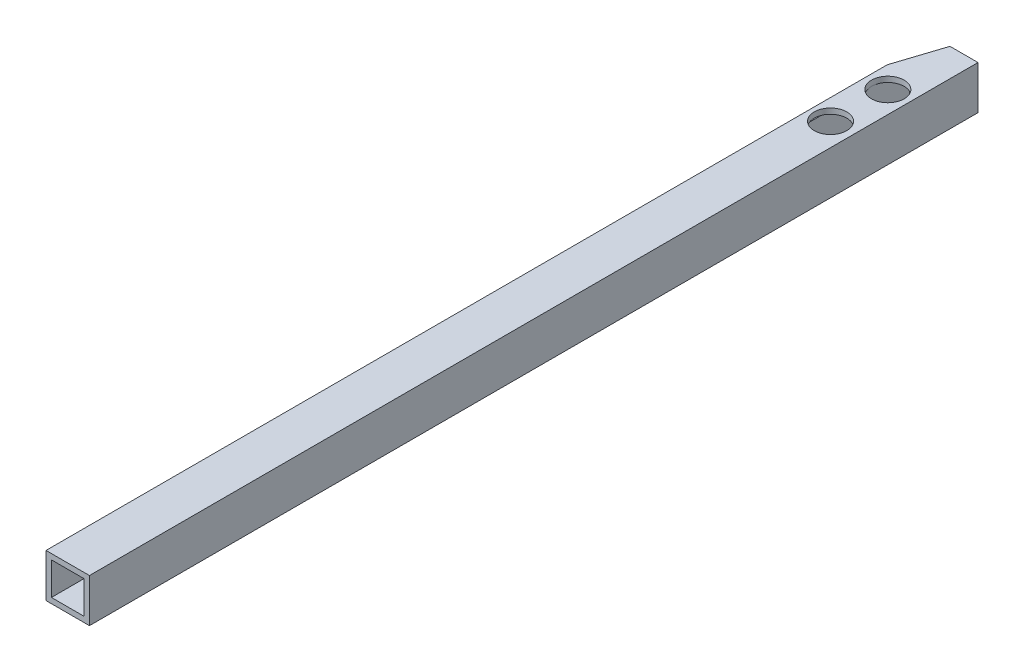
ISO-10303-21;
HEADER;
FILE_DESCRIPTION(('STEP AP214'),'2;1');
FILE_NAME('part.step','',(''),(''),'','','');
FILE_SCHEMA(('AUTOMOTIVE_DESIGN { 1 0 10303 214 1 1 1 1 }'));
ENDSEC;
DATA;
#1=APPLICATION_CONTEXT('core data for automotive mechanical design processes');
#2=APPLICATION_PROTOCOL_DEFINITION('international standard','automotive_design',2000,#1);
#3=PRODUCT_CONTEXT('',#1,'mechanical');
#4=PRODUCT('Part','Part','',(#3));
#5=PRODUCT_RELATED_PRODUCT_CATEGORY('part','',(#4));
#6=PRODUCT_DEFINITION_FORMATION('','',#4);
#7=PRODUCT_DEFINITION_CONTEXT('part definition',#1,'design');
#8=PRODUCT_DEFINITION('design','',#6,#7);
#9=PRODUCT_DEFINITION_SHAPE('','',#8);
#10=(LENGTH_UNIT() NAMED_UNIT(*) SI_UNIT(.MILLI.,.METRE.));
#11=(NAMED_UNIT(*) PLANE_ANGLE_UNIT() SI_UNIT($,.RADIAN.));
#12=(NAMED_UNIT(*) SI_UNIT($,.STERADIAN.) SOLID_ANGLE_UNIT());
#13=UNCERTAINTY_MEASURE_WITH_UNIT(LENGTH_MEASURE(1.E-05),#10,'distance_accuracy_value','');
#14=(GEOMETRIC_REPRESENTATION_CONTEXT(3) GLOBAL_UNCERTAINTY_ASSIGNED_CONTEXT((#13)) GLOBAL_UNIT_ASSIGNED_CONTEXT((#10,
#11,#12)) REPRESENTATION_CONTEXT('',''));
#15=CARTESIAN_POINT('',(0.,0.,0.));
#16=DIRECTION('',(0.,0.,1.));
#17=DIRECTION('',(1.,0.,0.));
#18=AXIS2_PLACEMENT_3D('',#15,#16,#17);
#19=CARTESIAN_POINT('',(-9.525,-9.525,266.7));
#20=DIRECTION('',(0.,1.,0.));
#21=DIRECTION('',(0.,0.,1.));
#22=AXIS2_PLACEMENT_3D('',#19,#20,#21);
#23=PLANE('',#22);
#24=DIRECTION('',(0.309016994375063,0.,-0.951056516295116));
#25=VECTOR('',#24,1.);
#26=CARTESIAN_POINT('',(-156.9077726563,-9.525,218.812434278532));
#27=LINE('',#26,#25);
#28=CARTESIAN_POINT('',(-9.525,-9.525,-234.785098788817));
#29=VERTEX_POINT('',#28);
#30=CARTESIAN_POINT('',(-3.69434814953062,-9.525,-252.73));
#31=VERTEX_POINT('',#30);
#32=EDGE_CURVE('E250',#29,#31,#27,.T.);
#33=ORIENTED_EDGE('',*,*,#32,.F.);
#34=DIRECTION('',(0.,0.,-1.));
#35=VECTOR('',#34,1.);
#36=CARTESIAN_POINT('',(-9.525,-9.525,266.7));
#37=LINE('',#36,#35);
#38=CARTESIAN_POINT('',(-9.525,-9.525,-212.725));
#39=VERTEX_POINT('',#38);
#40=EDGE_CURVE('E187',#39,#29,#37,.T.);
#41=ORIENTED_EDGE('',*,*,#40,.F.);
#42=CARTESIAN_POINT('',(0.,-9.525,-212.725));
#43=DIRECTION('',(0.,1.,0.));
#44=DIRECTION('',(0.,0.,1.));
#45=AXIS2_PLACEMENT_3D('',#42,#43,#44);
#46=CIRCLE('',#45,9.525);
#47=CARTESIAN_POINT('',(9.525,-9.525,-212.725));
#48=VERTEX_POINT('',#47);
#49=EDGE_CURVE('E268',#48,#39,#46,.T.);
#50=ORIENTED_EDGE('',*,*,#49,.F.);
#51=DIRECTION('',(0.,0.,-1.));
#52=VECTOR('',#51,1.);
#53=CARTESIAN_POINT('',(9.52500000000001,-9.525,266.7));
#54=LINE('',#53,#52);
#55=CARTESIAN_POINT('',(9.52500000000001,-9.525,-252.73));
#56=VERTEX_POINT('',#55);
#57=EDGE_CURVE('E181',#48,#56,#54,.T.);
#58=ORIENTED_EDGE('',*,*,#57,.T.);
#59=DIRECTION('',(1.,0.,0.));
#60=VECTOR('',#59,1.);
#61=CARTESIAN_POINT('',(-9.525,-9.525,-252.73));
#62=LINE('',#61,#60);
#63=EDGE_CURVE('E262',#31,#56,#62,.T.);
#64=ORIENTED_EDGE('',*,*,#63,.F.);
#65=EDGE_LOOP('',(#33,#41,#50,#58,#64));
#66=FACE_BOUND('',#65,.T.);
#67=ADVANCED_FACE('F43',(#66),#23,.T.);
#68=CARTESIAN_POINT('',(9.525,9.525,266.7));
#69=DIRECTION('',(0.,-1.,0.));
#70=DIRECTION('',(0.,0.,-1.));
#71=AXIS2_PLACEMENT_3D('',#68,#69,#70);
#72=PLANE('',#71);
#73=DIRECTION('',(0.,0.,-1.));
#74=VECTOR('',#73,1.);
#75=CARTESIAN_POINT('',(-9.52500000000001,9.525,266.7));
#76=LINE('',#75,#74);
#77=CARTESIAN_POINT('',(-9.52500000000001,9.525,266.7));
#78=VERTEX_POINT('',#77);
#79=CARTESIAN_POINT('',(-9.52500000000001,9.525,-176.385676170462));
#80=VERTEX_POINT('',#79);
#81=EDGE_CURVE('E144',#78,#80,#76,.T.);
#82=ORIENTED_EDGE('',*,*,#81,.T.);
#83=CARTESIAN_POINT('',(-0.66054848365579,9.525,-179.870948658286));
#84=DIRECTION('',(0.,-1.,0.));
#85=DIRECTION('',(1.,0.,0.));
#86=AXIS2_PLACEMENT_3D('',#83,#84,#85);
#87=CIRCLE('',#86,9.525);
#88=CARTESIAN_POINT('',(-9.52500000000001,9.525,-183.35622114611));
#89=VERTEX_POINT('',#88);
#90=EDGE_CURVE('E152',#89,#80,#87,.T.);
#91=ORIENTED_EDGE('',*,*,#90,.F.);
#92=CARTESIAN_POINT('',(-9.52500000000001,9.525,-212.725));
#93=VERTEX_POINT('',#92);
#94=EDGE_CURVE('E145',#89,#93,#76,.T.);
#95=ORIENTED_EDGE('',*,*,#94,.T.);
#96=CARTESIAN_POINT('',(0.,9.525,-212.725));
#97=DIRECTION('',(0.,-1.,0.));
#98=DIRECTION('',(0.,0.,-1.));
#99=AXIS2_PLACEMENT_3D('',#96,#97,#98);
#100=CIRCLE('',#99,9.525);
#101=CARTESIAN_POINT('',(9.525,9.525,-212.725));
#102=VERTEX_POINT('',#101);
#103=EDGE_CURVE('E223',#102,#93,#100,.T.);
#104=ORIENTED_EDGE('',*,*,#103,.F.);
#105=DIRECTION('',(0.,0.,-1.));
#106=VECTOR('',#105,1.);
#107=CARTESIAN_POINT('',(9.525,9.525,266.7));
#108=LINE('',#107,#106);
#109=CARTESIAN_POINT('',(9.525,9.525,266.7));
#110=VERTEX_POINT('',#109);
#111=EDGE_CURVE('E175',#110,#102,#108,.T.);
#112=ORIENTED_EDGE('',*,*,#111,.F.);
#113=DIRECTION('',(-1.,0.,0.));
#114=VECTOR('',#113,1.);
#115=CARTESIAN_POINT('',(9.525,9.525,266.7));
#116=LINE('',#115,#114);
#117=EDGE_CURVE('E168',#110,#78,#116,.T.);
#118=ORIENTED_EDGE('',*,*,#117,.T.);
#119=EDGE_LOOP('',(#82,#91,#95,#104,#112,#118));
#120=FACE_BOUND('',#119,.T.);
#121=ADVANCED_FACE('F157',(#120),#72,.T.);
#122=CARTESIAN_POINT('',(0.,0.,266.7));
#123=DIRECTION('',(0.,0.,1.));
#124=DIRECTION('',(1.,0.,0.));
#125=AXIS2_PLACEMENT_3D('',#122,#123,#124);
#126=PLANE('',#125);
#127=DIRECTION('',(0.,-1.,0.));
#128=VECTOR('',#127,1.);
#129=CARTESIAN_POINT('',(-12.7,12.7,266.7));
#130=LINE('',#129,#128);
#131=CARTESIAN_POINT('',(-12.7,12.7,266.7));
#132=VERTEX_POINT('',#131);
#133=CARTESIAN_POINT('',(-12.7,-12.7,266.7));
#134=VERTEX_POINT('',#133);
#135=EDGE_CURVE('E192',#132,#134,#130,.T.);
#136=ORIENTED_EDGE('',*,*,#135,.T.);
#137=DIRECTION('',(1.,0.,0.));
#138=VECTOR('',#137,1.);
#139=CARTESIAN_POINT('',(-12.7,-12.7,266.7));
#140=LINE('',#139,#138);
#141=CARTESIAN_POINT('',(12.7,-12.7,266.7));
#142=VERTEX_POINT('',#141);
#143=EDGE_CURVE('E196',#134,#142,#140,.T.);
#144=ORIENTED_EDGE('',*,*,#143,.T.);
#145=DIRECTION('',(0.,1.,0.));
#146=VECTOR('',#145,1.);
#147=CARTESIAN_POINT('',(12.7,-12.7,266.7));
#148=LINE('',#147,#146);
#149=CARTESIAN_POINT('',(12.7,12.7,266.7));
#150=VERTEX_POINT('',#149);
#151=EDGE_CURVE('E199',#142,#150,#148,.T.);
#152=ORIENTED_EDGE('',*,*,#151,.T.);
#153=DIRECTION('',(-1.,0.,0.));
#154=VECTOR('',#153,1.);
#155=CARTESIAN_POINT('',(12.7,12.7,266.7));
#156=LINE('',#155,#154);
#157=EDGE_CURVE('E202',#150,#132,#156,.T.);
#158=ORIENTED_EDGE('',*,*,#157,.T.);
#159=EDGE_LOOP('',(#136,#144,#152,#158));
#160=FACE_BOUND('',#159,.T.);
#161=DIRECTION('',(1.,0.,0.));
#162=VECTOR('',#161,1.);
#163=CARTESIAN_POINT('',(-9.525,-9.525,266.7));
#164=LINE('',#163,#162);
#165=CARTESIAN_POINT('',(-9.525,-9.525,266.7));
#166=VERTEX_POINT('',#165);
#167=CARTESIAN_POINT('',(9.52500000000001,-9.525,266.7));
#168=VERTEX_POINT('',#167);
#169=EDGE_CURVE('E248',#166,#168,#164,.T.);
#170=ORIENTED_EDGE('',*,*,#169,.F.);
#171=DIRECTION('',(0.,-1.,0.));
#172=VECTOR('',#171,1.);
#173=CARTESIAN_POINT('',(-9.52500000000001,9.525,266.7));
#174=LINE('',#173,#172);
#175=EDGE_CURVE('E244',#78,#166,#174,.T.);
#176=ORIENTED_EDGE('',*,*,#175,.F.);
#177=ORIENTED_EDGE('',*,*,#117,.F.);
#178=DIRECTION('',(0.,1.,0.));
#179=VECTOR('',#178,1.);
#180=CARTESIAN_POINT('',(9.52500000000001,-9.525,266.7));
#181=LINE('',#180,#179);
#182=EDGE_CURVE('E239',#168,#110,#181,.T.);
#183=ORIENTED_EDGE('',*,*,#182,.F.);
#184=EDGE_LOOP('',(#170,#176,#177,#183));
#185=FACE_BOUND('',#184,.T.);
#186=ADVANCED_FACE('F247',(#160,#185),#126,.T.);
#187=CARTESIAN_POINT('',(-12.7,12.7,266.7));
#188=DIRECTION('',(1.,0.,0.));
#189=DIRECTION('',(0.,0.,-1.));
#190=AXIS2_PLACEMENT_3D('',#187,#188,#189);
#191=PLANE('',#190);
#192=DIRECTION('',(0.,0.,-1.));
#193=VECTOR('',#192,1.);
#194=CARTESIAN_POINT('',(-12.7,12.7,266.7));
#195=LINE('',#194,#193);
#196=CARTESIAN_POINT('',(-12.7,12.7,-225.01345355829));
#197=VERTEX_POINT('',#196);
#198=EDGE_CURVE('E205',#132,#197,#195,.T.);
#199=ORIENTED_EDGE('',*,*,#198,.T.);
#200=DIRECTION('',(0.,1.,0.));
#201=VECTOR('',#200,1.);
#202=CARTESIAN_POINT('',(-12.7,-12.7,-225.01345355829));
#203=LINE('',#202,#201);
#204=CARTESIAN_POINT('',(-12.7,-12.7,-225.01345355829));
#205=VERTEX_POINT('',#204);
#206=EDGE_CURVE('E272',#205,#197,#203,.T.);
#207=ORIENTED_EDGE('',*,*,#206,.F.);
#208=DIRECTION('',(0.,0.,-1.));
#209=VECTOR('',#208,1.);
#210=CARTESIAN_POINT('',(-12.7,-12.7,266.7));
#211=LINE('',#210,#209);
#212=EDGE_CURVE('E217',#134,#205,#211,.T.);
#213=ORIENTED_EDGE('',*,*,#212,.F.);
#214=ORIENTED_EDGE('',*,*,#135,.F.);
#215=EDGE_LOOP('',(#199,#207,#213,#214));
#216=FACE_BOUND('',#215,.T.);
#217=ADVANCED_FACE('F45',(#216),#191,.F.);
#218=CARTESIAN_POINT('',(-12.7,-12.7,266.7));
#219=DIRECTION('',(0.,1.,0.));
#220=DIRECTION('',(-1.,0.,0.));
#221=AXIS2_PLACEMENT_3D('',#218,#219,#220);
#222=PLANE('',#221);
#223=CARTESIAN_POINT('',(0.,-12.7,-212.725));
#224=DIRECTION('',(0.,1.,0.));
#225=DIRECTION('',(-1.,0.,0.));
#226=AXIS2_PLACEMENT_3D('',#223,#224,#225);
#227=CIRCLE('',#226,9.525);
#228=CARTESIAN_POINT('',(-9.52499999999999,-12.7,-212.725));
#229=VERTEX_POINT('',#228);
#230=EDGE_CURVE('E154',#229,#229,#227,.T.);
#231=ORIENTED_EDGE('',*,*,#230,.T.);
#232=EDGE_LOOP('',(#231));
#233=FACE_BOUND('',#232,.T.);
#234=ORIENTED_EDGE('',*,*,#212,.T.);
#235=DIRECTION('',(0.309016994375063,0.,-0.951056516295116));
#236=VECTOR('',#235,1.);
#237=CARTESIAN_POINT('',(-3.69434814953062,-12.7,-252.73));
#238=LINE('',#237,#236);
#239=CARTESIAN_POINT('',(-3.69434814953062,-12.7,-252.73));
#240=VERTEX_POINT('',#239);
#241=EDGE_CURVE('E294',#205,#240,#238,.T.);
#242=ORIENTED_EDGE('',*,*,#241,.T.);
#243=DIRECTION('',(1.,0.,0.));
#244=VECTOR('',#243,1.);
#245=CARTESIAN_POINT('',(12.7,-12.7,-252.73));
#246=LINE('',#245,#244);
#247=CARTESIAN_POINT('',(12.7,-12.7,-252.73));
#248=VERTEX_POINT('',#247);
#249=EDGE_CURVE('E297',#240,#248,#246,.T.);
#250=ORIENTED_EDGE('',*,*,#249,.T.);
#251=DIRECTION('',(0.,0.,-1.));
#252=VECTOR('',#251,1.);
#253=CARTESIAN_POINT('',(12.7,-12.7,266.7));
#254=LINE('',#253,#252);
#255=EDGE_CURVE('E213',#142,#248,#254,.T.);
#256=ORIENTED_EDGE('',*,*,#255,.F.);
#257=ORIENTED_EDGE('',*,*,#143,.F.);
#258=EDGE_LOOP('',(#234,#242,#250,#256,#257));
#259=FACE_BOUND('',#258,.T.);
#260=ADVANCED_FACE('F360',(#233,#259),#222,.F.);
#261=CARTESIAN_POINT('',(12.7,-12.7,266.7));
#262=DIRECTION('',(-1.,0.,0.));
#263=DIRECTION('',(0.,0.,1.));
#264=AXIS2_PLACEMENT_3D('',#261,#262,#263);
#265=PLANE('',#264);
#266=ORIENTED_EDGE('',*,*,#255,.T.);
#267=DIRECTION('',(0.,1.,0.));
#268=VECTOR('',#267,1.);
#269=CARTESIAN_POINT('',(12.7,-12.7,-252.73));
#270=LINE('',#269,#268);
#271=CARTESIAN_POINT('',(12.7,12.7,-252.73));
#272=VERTEX_POINT('',#271);
#273=EDGE_CURVE('E284',#248,#272,#270,.T.);
#274=ORIENTED_EDGE('',*,*,#273,.T.);
#275=DIRECTION('',(0.,0.,-1.));
#276=VECTOR('',#275,1.);
#277=CARTESIAN_POINT('',(12.7,12.7,266.7));
#278=LINE('',#277,#276);
#279=EDGE_CURVE('E209',#150,#272,#278,.T.);
#280=ORIENTED_EDGE('',*,*,#279,.F.);
#281=ORIENTED_EDGE('',*,*,#151,.F.);
#282=EDGE_LOOP('',(#266,#274,#280,#281));
#283=FACE_BOUND('',#282,.T.);
#284=ADVANCED_FACE('F363',(#283),#265,.F.);
#285=CARTESIAN_POINT('',(12.7,12.7,266.7));
#286=DIRECTION('',(0.,-1.,0.));
#287=DIRECTION('',(1.,0.,0.));
#288=AXIS2_PLACEMENT_3D('',#285,#286,#287);
#289=PLANE('',#288);
#290=CARTESIAN_POINT('',(-0.660548483655789,12.7,-179.870948658286));
#291=DIRECTION('',(0.,-1.,0.));
#292=DIRECTION('',(1.,0.,0.));
#293=AXIS2_PLACEMENT_3D('',#290,#291,#292);
#294=CIRCLE('',#293,9.525);
#295=CARTESIAN_POINT('',(8.86445151634421,12.7,-179.870948658286));
#296=VERTEX_POINT('',#295);
#297=EDGE_CURVE('E161',#296,#296,#294,.T.);
#298=ORIENTED_EDGE('',*,*,#297,.T.);
#299=EDGE_LOOP('',(#298));
#300=FACE_BOUND('',#299,.T.);
#301=CARTESIAN_POINT('',(0.,12.7,-212.725));
#302=DIRECTION('',(0.,1.,0.));
#303=DIRECTION('',(-1.,0.,0.));
#304=AXIS2_PLACEMENT_3D('',#301,#302,#303);
#305=CIRCLE('',#304,9.525);
#306=CARTESIAN_POINT('',(-9.52499999999999,12.7,-212.725));
#307=VERTEX_POINT('',#306);
#308=EDGE_CURVE('E276',#307,#307,#305,.T.);
#309=ORIENTED_EDGE('',*,*,#308,.F.);
#310=EDGE_LOOP('',(#309));
#311=FACE_BOUND('',#310,.T.);
#312=DIRECTION('',(1.,0.,0.));
#313=VECTOR('',#312,1.);
#314=CARTESIAN_POINT('',(12.7,12.7,-252.73));
#315=LINE('',#314,#313);
#316=CARTESIAN_POINT('',(-3.69434814953062,12.7,-252.73));
#317=VERTEX_POINT('',#316);
#318=EDGE_CURVE('E291',#317,#272,#315,.T.);
#319=ORIENTED_EDGE('',*,*,#318,.F.);
#320=DIRECTION('',(0.309016994375063,0.,-0.951056516295116));
#321=VECTOR('',#320,1.);
#322=CARTESIAN_POINT('',(-3.69434814953062,12.7,-252.73));
#323=LINE('',#322,#321);
#324=EDGE_CURVE('E66',#197,#317,#323,.T.);
#325=ORIENTED_EDGE('',*,*,#324,.F.);
#326=ORIENTED_EDGE('',*,*,#198,.F.);
#327=ORIENTED_EDGE('',*,*,#157,.F.);
#328=ORIENTED_EDGE('',*,*,#279,.T.);
#329=EDGE_LOOP('',(#319,#325,#326,#327,#328));
#330=FACE_BOUND('',#329,.T.);
#331=ADVANCED_FACE('F308',(#300,#311,#330),#289,.F.);
#332=CARTESIAN_POINT('',(-9.52500000000001,9.525,266.7));
#333=DIRECTION('',(1.,0.,0.));
#334=DIRECTION('',(0.,1.,0.));
#335=AXIS2_PLACEMENT_3D('',#332,#333,#334);
#336=PLANE('',#335);
#337=DIRECTION('',(0.,-1.,0.));
#338=VECTOR('',#337,1.);
#339=CARTESIAN_POINT('',(-9.52500000000001,9.52500000000049,-234.785098788817));
#340=LINE('',#339,#338);
#341=CARTESIAN_POINT('',(-9.52500000000001,9.525,-234.785098788818));
#342=VERTEX_POINT('',#341);
#343=EDGE_CURVE('E255',#342,#29,#340,.T.);
#344=ORIENTED_EDGE('',*,*,#343,.F.);
#345=EDGE_CURVE('E147',#93,#342,#76,.T.);
#346=ORIENTED_EDGE('',*,*,#345,.F.);
#347=ORIENTED_EDGE('',*,*,#94,.F.);
#348=EDGE_CURVE('E137',#80,#89,#76,.T.);
#349=ORIENTED_EDGE('',*,*,#348,.F.);
#350=ORIENTED_EDGE('',*,*,#81,.F.);
#351=ORIENTED_EDGE('',*,*,#175,.T.);
#352=EDGE_CURVE('E188',#166,#39,#37,.T.);
#353=ORIENTED_EDGE('',*,*,#352,.T.);
#354=ORIENTED_EDGE('',*,*,#40,.T.);
#355=EDGE_LOOP('',(#344,#346,#347,#349,#350,#351,#353,#354));
#356=FACE_BOUND('',#355,.T.);
#357=ADVANCED_FACE('F164',(#356),#336,.T.);
#358=EDGE_CURVE('E269',#39,#48,#46,.T.);
#359=ORIENTED_EDGE('',*,*,#358,.F.);
#360=ORIENTED_EDGE('',*,*,#352,.F.);
#361=ORIENTED_EDGE('',*,*,#169,.T.);
#362=EDGE_CURVE('E183',#168,#48,#54,.T.);
#363=ORIENTED_EDGE('',*,*,#362,.T.);
#364=EDGE_LOOP('',(#359,#360,#361,#363));
#365=FACE_BOUND('',#364,.T.);
#366=ADVANCED_FACE('F325',(#365),#23,.T.);
#367=CARTESIAN_POINT('',(9.52500000000001,-9.525,266.7));
#368=DIRECTION('',(-1.,0.,0.));
#369=DIRECTION('',(0.,-1.,0.));
#370=AXIS2_PLACEMENT_3D('',#367,#368,#369);
#371=PLANE('',#370);
#372=ORIENTED_EDGE('',*,*,#111,.T.);
#373=CARTESIAN_POINT('',(9.525,9.525,-252.73));
#374=VERTEX_POINT('',#373);
#375=EDGE_CURVE('E172',#102,#374,#108,.T.);
#376=ORIENTED_EDGE('',*,*,#375,.T.);
#377=DIRECTION('',(0.,1.,0.));
#378=VECTOR('',#377,1.);
#379=CARTESIAN_POINT('',(9.52500000000001,-9.525,-252.73));
#380=LINE('',#379,#378);
#381=EDGE_CURVE('E265',#56,#374,#380,.T.);
#382=ORIENTED_EDGE('',*,*,#381,.F.);
#383=ORIENTED_EDGE('',*,*,#57,.F.);
#384=ORIENTED_EDGE('',*,*,#362,.F.);
#385=ORIENTED_EDGE('',*,*,#182,.T.);
#386=EDGE_LOOP('',(#372,#376,#382,#383,#384,#385));
#387=FACE_BOUND('',#386,.T.);
#388=ADVANCED_FACE('F236',(#387),#371,.T.);
#389=DIRECTION('',(-0.309016994375063,0.,0.951056516295116));
#390=VECTOR('',#389,1.);
#391=CARTESIAN_POINT('',(-155.08865952772,9.525,213.213779750444));
#392=LINE('',#391,#390);
#393=CARTESIAN_POINT('',(-3.69434814953062,9.525,-252.73));
#394=VERTEX_POINT('',#393);
#395=EDGE_CURVE('E11',#394,#342,#392,.T.);
#396=ORIENTED_EDGE('',*,*,#395,.F.);
#397=DIRECTION('',(-1.,0.,0.));
#398=VECTOR('',#397,1.);
#399=CARTESIAN_POINT('',(9.525,9.525,-252.73));
#400=LINE('',#399,#398);
#401=EDGE_CURVE('E52',#374,#394,#400,.T.);
#402=ORIENTED_EDGE('',*,*,#401,.F.);
#403=ORIENTED_EDGE('',*,*,#375,.F.);
#404=EDGE_CURVE('E221',#93,#102,#100,.T.);
#405=ORIENTED_EDGE('',*,*,#404,.F.);
#406=ORIENTED_EDGE('',*,*,#345,.T.);
#407=EDGE_LOOP('',(#396,#402,#403,#405,#406));
#408=FACE_BOUND('',#407,.T.);
#409=ADVANCED_FACE('F234',(#408),#72,.T.);
#410=CARTESIAN_POINT('',(0.,-12.7,-212.725));
#411=DIRECTION('',(0.,1.,0.));
#412=DIRECTION('',(-1.,0.,0.));
#413=AXIS2_PLACEMENT_3D('',#410,#411,#412);
#414=CYLINDRICAL_SURFACE('',#413,9.525);
#415=ORIENTED_EDGE('',*,*,#103,.T.);
#416=ORIENTED_EDGE('',*,*,#404,.T.);
#417=EDGE_LOOP('',(#415,#416));
#418=FACE_BOUND('',#417,.T.);
#419=ORIENTED_EDGE('',*,*,#308,.T.);
#420=EDGE_LOOP('',(#419));
#421=FACE_BOUND('',#420,.T.);
#422=ADVANCED_FACE('F230',(#418,#421),#414,.F.);
#423=CARTESIAN_POINT('',(-3.69434814953062,-12.7,-252.73));
#424=DIRECTION('',(0.951056516295116,0.,0.309016994375063));
#425=DIRECTION('',(0.309016994375063,0.,-0.951056516295116));
#426=AXIS2_PLACEMENT_3D('',#423,#424,#425);
#427=PLANE('',#426);
#428=ORIENTED_EDGE('',*,*,#32,.T.);
#429=DIRECTION('',(0.,1.,0.));
#430=VECTOR('',#429,1.);
#431=CARTESIAN_POINT('',(-3.69434814953062,-12.7,-252.73));
#432=LINE('',#431,#430);
#433=EDGE_CURVE('E280',#240,#31,#432,.T.);
#434=ORIENTED_EDGE('',*,*,#433,.F.);
#435=ORIENTED_EDGE('',*,*,#241,.F.);
#436=ORIENTED_EDGE('',*,*,#206,.T.);
#437=ORIENTED_EDGE('',*,*,#324,.T.);
#438=EDGE_CURVE('E285',#394,#317,#432,.T.);
#439=ORIENTED_EDGE('',*,*,#438,.F.);
#440=ORIENTED_EDGE('',*,*,#395,.T.);
#441=ORIENTED_EDGE('',*,*,#343,.T.);
#442=EDGE_LOOP('',(#428,#434,#435,#436,#437,#439,#440,#441));
#443=FACE_BOUND('',#442,.T.);
#444=ADVANCED_FACE('F352',(#443),#427,.F.);
#445=CARTESIAN_POINT('',(12.7,-12.7,-252.73));
#446=DIRECTION('',(0.,0.,1.));
#447=DIRECTION('',(1.,0.,0.));
#448=AXIS2_PLACEMENT_3D('',#445,#446,#447);
#449=PLANE('',#448);
#450=ORIENTED_EDGE('',*,*,#63,.T.);
#451=ORIENTED_EDGE('',*,*,#381,.T.);
#452=ORIENTED_EDGE('',*,*,#401,.T.);
#453=ORIENTED_EDGE('',*,*,#438,.T.);
#454=ORIENTED_EDGE('',*,*,#318,.T.);
#455=ORIENTED_EDGE('',*,*,#273,.F.);
#456=ORIENTED_EDGE('',*,*,#249,.F.);
#457=ORIENTED_EDGE('',*,*,#433,.T.);
#458=EDGE_LOOP('',(#450,#451,#452,#453,#454,#455,#456,#457));
#459=FACE_BOUND('',#458,.T.);
#460=ADVANCED_FACE('F318',(#459),#449,.F.);
#461=ORIENTED_EDGE('',*,*,#49,.T.);
#462=ORIENTED_EDGE('',*,*,#358,.T.);
#463=EDGE_LOOP('',(#461,#462));
#464=FACE_BOUND('',#463,.T.);
#465=ORIENTED_EDGE('',*,*,#230,.F.);
#466=EDGE_LOOP('',(#465));
#467=FACE_BOUND('',#466,.T.);
#468=ADVANCED_FACE('F311',(#464,#467),#414,.F.);
#469=CARTESIAN_POINT('',(-0.66054848365579,9.525,-179.870948658286));
#470=DIRECTION('',(0.,1.,0.));
#471=DIRECTION('',(-1.,0.,0.));
#472=AXIS2_PLACEMENT_3D('',#469,#470,#471);
#473=CYLINDRICAL_SURFACE('',#472,9.525);
#474=EDGE_CURVE('E58',#80,#89,#87,.T.);
#475=ORIENTED_EDGE('',*,*,#474,.T.);
#476=ORIENTED_EDGE('',*,*,#90,.T.);
#477=EDGE_LOOP('',(#475,#476));
#478=FACE_BOUND('',#477,.T.);
#479=ORIENTED_EDGE('',*,*,#297,.F.);
#480=EDGE_LOOP('',(#479));
#481=FACE_BOUND('',#480,.T.);
#482=ADVANCED_FACE('F150',(#478,#481),#473,.F.);
#483=CARTESIAN_POINT('',(-0.66054848365579,9.525,-179.870948658286));
#484=DIRECTION('',(0.,-1.,0.));
#485=DIRECTION('',(1.,0.,0.));
#486=AXIS2_PLACEMENT_3D('',#483,#484,#485);
#487=PLANE('',#486);
#488=ORIENTED_EDGE('',*,*,#348,.T.);
#489=ORIENTED_EDGE('',*,*,#474,.F.);
#490=EDGE_LOOP('',(#488,#489));
#491=FACE_BOUND('',#490,.T.);
#492=ADVANCED_FACE('F138',(#491),#487,.F.);
#493=CLOSED_SHELL('',(#67,#121,#186,#217,#260,#284,#331,#357,#366,#388,#409,#422,#444,#460,#468,
#482,#492));
#494=MANIFOLD_SOLID_BREP('B2',#493);
#495=ADVANCED_BREP_SHAPE_REPRESENTATION('',(#18,#494),#14);
#496=SHAPE_DEFINITION_REPRESENTATION(#9,#495);
ENDSEC;
END-ISO-10303-21;
